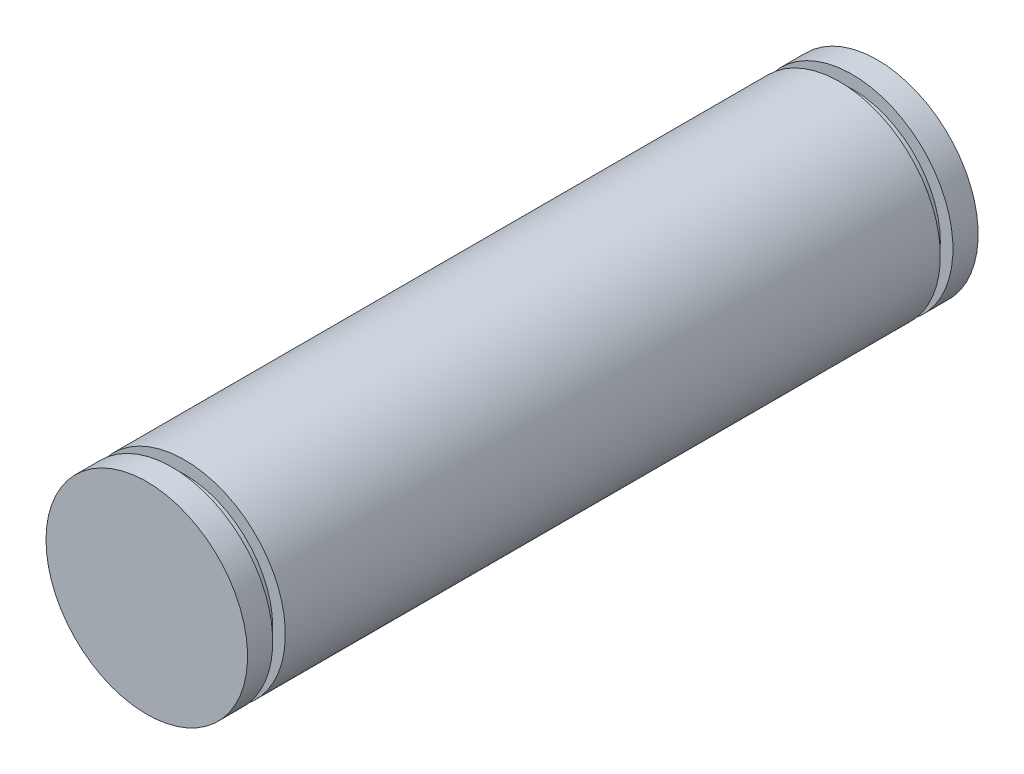
ISO-10303-21;
HEADER;
FILE_DESCRIPTION(('STEP AP214'),'2;1');
FILE_NAME('part.step','',(''),(''),'','','');
FILE_SCHEMA(('AUTOMOTIVE_DESIGN { 1 0 10303 214 1 1 1 1 }'));
ENDSEC;
DATA;
#1=APPLICATION_CONTEXT('core data for automotive mechanical design processes');
#2=APPLICATION_PROTOCOL_DEFINITION('international standard','automotive_design',2000,#1);
#3=PRODUCT_CONTEXT('',#1,'mechanical');
#4=PRODUCT('Part','Part','',(#3));
#5=PRODUCT_RELATED_PRODUCT_CATEGORY('part','',(#4));
#6=PRODUCT_DEFINITION_FORMATION('','',#4);
#7=PRODUCT_DEFINITION_CONTEXT('part definition',#1,'design');
#8=PRODUCT_DEFINITION('design','',#6,#7);
#9=PRODUCT_DEFINITION_SHAPE('','',#8);
#10=(LENGTH_UNIT() NAMED_UNIT(*) SI_UNIT(.MILLI.,.METRE.));
#11=(NAMED_UNIT(*) PLANE_ANGLE_UNIT() SI_UNIT($,.RADIAN.));
#12=(NAMED_UNIT(*) SI_UNIT($,.STERADIAN.) SOLID_ANGLE_UNIT());
#13=UNCERTAINTY_MEASURE_WITH_UNIT(LENGTH_MEASURE(1.E-05),#10,'distance_accuracy_value','');
#14=(GEOMETRIC_REPRESENTATION_CONTEXT(3) GLOBAL_UNCERTAINTY_ASSIGNED_CONTEXT((#13)) GLOBAL_UNIT_ASSIGNED_CONTEXT((#10,
#11,#12)) REPRESENTATION_CONTEXT('',''));
#15=CARTESIAN_POINT('',(0.,0.,0.));
#16=DIRECTION('',(0.,0.,1.));
#17=DIRECTION('',(1.,0.,0.));
#18=AXIS2_PLACEMENT_3D('',#15,#16,#17);
#19=CARTESIAN_POINT('',(0.,0.,58.));
#20=DIRECTION('',(0.,0.,-1.));
#21=DIRECTION('',(-1.,0.,0.));
#22=AXIS2_PLACEMENT_3D('',#19,#20,#21);
#23=CYLINDRICAL_SURFACE('',#22,8.);
#24=CARTESIAN_POINT('',(0.,0.,55.));
#25=DIRECTION('',(0.,0.,1.));
#26=DIRECTION('',(1.,0.,0.));
#27=AXIS2_PLACEMENT_3D('',#24,#25,#26);
#28=CIRCLE('',#27,8.);
#29=CARTESIAN_POINT('',(-8.,0.,55.));
#30=VERTEX_POINT('',#29);
#31=EDGE_CURVE('E54',#30,#30,#28,.T.);
#32=CARTESIAN_POINT('',(0.,0.,3.));
#33=DIRECTION('',(0.,0.,-1.));
#34=DIRECTION('',(-1.,0.,0.));
#35=AXIS2_PLACEMENT_3D('',#32,#33,#34);
#36=CIRCLE('',#35,8.);
#37=CARTESIAN_POINT('',(-8.,0.,3.));
#38=VERTEX_POINT('',#37);
#39=EDGE_CURVE('E43',#38,#38,#36,.T.);
#40=CARTESIAN_POINT('',(-8.,0.,55.));
#41=CARTESIAN_POINT('',(-8.,0.,54.4583333333333));
#42=CARTESIAN_POINT('',(-8.,0.,53.9166666666667));
#43=CARTESIAN_POINT('',(-8.,0.,52.8333333333333));
#44=CARTESIAN_POINT('',(-8.,0.,52.2916666666667));
#45=CARTESIAN_POINT('',(-8.,0.,51.2083333333333));
#46=CARTESIAN_POINT('',(-8.,0.,50.6666666666667));
#47=CARTESIAN_POINT('',(-8.,0.,49.5833333333333));
#48=CARTESIAN_POINT('',(-8.,0.,49.0416666666667));
#49=CARTESIAN_POINT('',(-8.,0.,47.9583333333333));
#50=CARTESIAN_POINT('',(-8.,0.,47.4166666666667));
#51=CARTESIAN_POINT('',(-8.,0.,46.3333333333333));
#52=CARTESIAN_POINT('',(-8.,0.,45.7916666666667));
#53=CARTESIAN_POINT('',(-8.,0.,44.7083333333333));
#54=CARTESIAN_POINT('',(-8.,0.,44.1666666666667));
#55=CARTESIAN_POINT('',(-8.,0.,43.0833333333333));
#56=CARTESIAN_POINT('',(-8.,0.,42.5416666666667));
#57=CARTESIAN_POINT('',(-8.,0.,41.4583333333333));
#58=CARTESIAN_POINT('',(-8.,0.,40.9166666666667));
#59=CARTESIAN_POINT('',(-8.,0.,39.8333333333333));
#60=CARTESIAN_POINT('',(-8.,0.,39.2916666666667));
#61=CARTESIAN_POINT('',(-8.,0.,38.2083333333333));
#62=CARTESIAN_POINT('',(-8.,0.,37.6666666666667));
#63=CARTESIAN_POINT('',(-8.,0.,36.5833333333333));
#64=CARTESIAN_POINT('',(-8.,0.,36.0416666666667));
#65=CARTESIAN_POINT('',(-8.,0.,34.9583333333333));
#66=CARTESIAN_POINT('',(-8.,0.,34.4166666666667));
#67=CARTESIAN_POINT('',(-8.,0.,33.3333333333333));
#68=CARTESIAN_POINT('',(-8.,0.,32.7916666666667));
#69=CARTESIAN_POINT('',(-8.,0.,31.7083333333333));
#70=CARTESIAN_POINT('',(-8.,0.,31.1666666666667));
#71=CARTESIAN_POINT('',(-8.,0.,30.0833333333333));
#72=CARTESIAN_POINT('',(-8.,0.,29.5416666666667));
#73=CARTESIAN_POINT('',(-8.,0.,28.4583333333333));
#74=CARTESIAN_POINT('',(-8.,0.,27.9166666666667));
#75=CARTESIAN_POINT('',(-8.,0.,26.8333333333333));
#76=CARTESIAN_POINT('',(-8.,0.,26.2916666666667));
#77=CARTESIAN_POINT('',(-8.,0.,25.2083333333333));
#78=CARTESIAN_POINT('',(-8.,0.,24.6666666666667));
#79=CARTESIAN_POINT('',(-8.,0.,23.5833333333333));
#80=CARTESIAN_POINT('',(-8.,0.,23.0416666666667));
#81=CARTESIAN_POINT('',(-8.,0.,21.9583333333333));
#82=CARTESIAN_POINT('',(-8.,0.,21.4166666666667));
#83=CARTESIAN_POINT('',(-8.,0.,20.3333333333333));
#84=CARTESIAN_POINT('',(-8.,0.,19.7916666666667));
#85=CARTESIAN_POINT('',(-8.,0.,18.7083333333333));
#86=CARTESIAN_POINT('',(-8.,0.,18.1666666666667));
#87=CARTESIAN_POINT('',(-8.,0.,17.0833333333333));
#88=CARTESIAN_POINT('',(-8.,0.,16.5416666666667));
#89=CARTESIAN_POINT('',(-8.,0.,15.4583333333333));
#90=CARTESIAN_POINT('',(-8.,0.,14.9166666666667));
#91=CARTESIAN_POINT('',(-8.,0.,13.8333333333333));
#92=CARTESIAN_POINT('',(-8.,0.,13.2916666666667));
#93=CARTESIAN_POINT('',(-8.,0.,12.2083333333333));
#94=CARTESIAN_POINT('',(-8.,0.,11.6666666666667));
#95=CARTESIAN_POINT('',(-8.,0.,10.5833333333333));
#96=CARTESIAN_POINT('',(-8.,0.,10.0416666666667));
#97=CARTESIAN_POINT('',(-8.,0.,8.95833333333333));
#98=CARTESIAN_POINT('',(-8.,0.,8.41666666666666));
#99=CARTESIAN_POINT('',(-8.,0.,7.33333333333333));
#100=CARTESIAN_POINT('',(-8.,0.,6.79166666666667));
#101=CARTESIAN_POINT('',(-8.,0.,5.70833333333334));
#102=CARTESIAN_POINT('',(-8.,0.,5.16666666666667));
#103=CARTESIAN_POINT('',(-8.,0.,4.08333333333334));
#104=CARTESIAN_POINT('',(-8.,0.,3.54166666666667));
#105=CARTESIAN_POINT('',(-8.,0.,3.));
#106=B_SPLINE_CURVE_WITH_KNOTS('',3,(#40,#41,#42,#43,#44,#45,#46,#47,#48,#49,#50,#51,#52,#53,
#54,#55,#56,#57,#58,#59,#60,#61,#62,#63,#64,#65,#66,#67,#68,#69,#70,#71,#72,#73,#74,#75,#76,#77,
#78,#79,#80,#81,#82,#83,#84,#85,#86,#87,#88,#89,#90,#91,#92,#93,#94,#95,#96,#97,#98,#99,#100,
#101,#102,#103,#104,#105),.UNSPECIFIED.,.F.,.F.,(4,2,2,2,2,2,2,2,2,2,2,2,2,2,2,2,2,2,2,2,2,2,2,
2,2,2,2,2,2,2,2,2,4),(0.,1.625,3.25,4.875,6.5,8.125,9.75,11.375,13.,14.625,16.25,17.875,19.5,
21.125,22.75,24.375,26.,27.625,29.25,30.875,32.5,34.125,35.75,37.375,39.,40.625,42.25,43.875,
45.5,47.125,48.75,50.375,52.),.UNSPECIFIED.);
#107=EDGE_CURVE('BSEAM39',#30,#38,#106,.T.);
#108=ORIENTED_EDGE('',*,*,#31,.F.);
#109=ORIENTED_EDGE('',*,*,#39,.F.);
#110=ORIENTED_EDGE('',*,*,#107,.T.);
#111=ORIENTED_EDGE('',*,*,#107,.F.);
#112=EDGE_LOOP('',(#108,#110,#109,#111));
#113=FACE_BOUND('',#112,.T.);
#114=ADVANCED_FACE('F39',(#113),#23,.T.);
#115=CARTESIAN_POINT('',(0.,0.,55.));
#116=DIRECTION('',(0.,0.,1.));
#117=DIRECTION('',(1.,0.,0.));
#118=AXIS2_PLACEMENT_3D('',#115,#116,#117);
#119=PLANE('',#118);
#120=CARTESIAN_POINT('',(0.,0.,55.));
#121=DIRECTION('',(0.,0.,1.));
#122=DIRECTION('',(1.,0.,0.));
#123=AXIS2_PLACEMENT_3D('',#120,#121,#122);
#124=CIRCLE('',#123,7.);
#125=CARTESIAN_POINT('',(7.,0.,55.));
#126=VERTEX_POINT('',#125);
#127=EDGE_CURVE('E64',#126,#126,#124,.T.);
#128=ORIENTED_EDGE('',*,*,#127,.F.);
#129=EDGE_LOOP('',(#128));
#130=FACE_BOUND('',#129,.T.);
#131=ORIENTED_EDGE('',*,*,#31,.T.);
#132=EDGE_LOOP('',(#131));
#133=FACE_BOUND('',#132,.T.);
#134=ADVANCED_FACE('F104',(#130,#133),#119,.T.);
#135=CARTESIAN_POINT('',(0.,0.,56.));
#136=DIRECTION('',(0.,0.,1.));
#137=DIRECTION('',(1.,0.,0.));
#138=AXIS2_PLACEMENT_3D('',#135,#136,#137);
#139=PLANE('',#138);
#140=CARTESIAN_POINT('',(0.,0.,56.));
#141=DIRECTION('',(0.,0.,1.));
#142=DIRECTION('',(1.,0.,0.));
#143=AXIS2_PLACEMENT_3D('',#140,#141,#142);
#144=CIRCLE('',#143,7.);
#145=CARTESIAN_POINT('',(7.,0.,56.));
#146=VERTEX_POINT('',#145);
#147=EDGE_CURVE('E57',#146,#146,#144,.T.);
#148=ORIENTED_EDGE('',*,*,#147,.T.);
#149=EDGE_LOOP('',(#148));
#150=FACE_BOUND('',#149,.T.);
#151=CARTESIAN_POINT('',(0.,0.,56.));
#152=DIRECTION('',(0.,0.,1.));
#153=DIRECTION('',(1.,0.,0.));
#154=AXIS2_PLACEMENT_3D('',#151,#152,#153);
#155=CIRCLE('',#154,8.);
#156=CARTESIAN_POINT('',(-8.,0.,56.));
#157=VERTEX_POINT('',#156);
#158=EDGE_CURVE('E60',#157,#157,#155,.T.);
#159=ORIENTED_EDGE('',*,*,#158,.F.);
#160=EDGE_LOOP('',(#159));
#161=FACE_BOUND('',#160,.T.);
#162=ADVANCED_FACE('F92',(#150,#161),#139,.F.);
#163=CARTESIAN_POINT('',(0.,0.,55.));
#164=DIRECTION('',(0.,0.,1.));
#165=DIRECTION('',(1.,0.,0.));
#166=AXIS2_PLACEMENT_3D('',#163,#164,#165);
#167=CYLINDRICAL_SURFACE('',#166,7.);
#168=ORIENTED_EDGE('',*,*,#127,.T.);
#169=EDGE_LOOP('',(#168));
#170=FACE_BOUND('',#169,.T.);
#171=ORIENTED_EDGE('',*,*,#147,.F.);
#172=EDGE_LOOP('',(#171));
#173=FACE_BOUND('',#172,.T.);
#174=ADVANCED_FACE('F95',(#170,#173),#167,.T.);
#175=CARTESIAN_POINT('',(0.,0.,58.));
#176=DIRECTION('',(0.,0.,1.));
#177=DIRECTION('',(1.,0.,0.));
#178=AXIS2_PLACEMENT_3D('',#175,#176,#177);
#179=PLANE('',#178);
#180=CARTESIAN_POINT('',(0.,0.,58.));
#181=DIRECTION('',(0.,0.,1.));
#182=DIRECTION('',(1.,0.,0.));
#183=AXIS2_PLACEMENT_3D('',#180,#181,#182);
#184=CIRCLE('',#183,8.);
#185=CARTESIAN_POINT('',(-8.,0.,58.));
#186=VERTEX_POINT('',#185);
#187=EDGE_CURVE('E11',#186,#186,#184,.T.);
#188=ORIENTED_EDGE('',*,*,#187,.T.);
#189=EDGE_LOOP('',(#188));
#190=FACE_BOUND('',#189,.T.);
#191=ADVANCED_FACE('F97',(#190),#179,.T.);
#192=CARTESIAN_POINT('',(-8.,0.,56.));
#193=CARTESIAN_POINT('',(-8.,0.,56.0208333333333));
#194=CARTESIAN_POINT('',(-8.,0.,56.0416666666667));
#195=CARTESIAN_POINT('',(-8.,0.,56.0833333333333));
#196=CARTESIAN_POINT('',(-8.,0.,56.1041666666667));
#197=CARTESIAN_POINT('',(-8.,0.,56.1458333333333));
#198=CARTESIAN_POINT('',(-8.,0.,56.1666666666667));
#199=CARTESIAN_POINT('',(-8.,0.,56.2083333333333));
#200=CARTESIAN_POINT('',(-8.,0.,56.2291666666667));
#201=CARTESIAN_POINT('',(-8.,0.,56.2708333333333));
#202=CARTESIAN_POINT('',(-8.,0.,56.2916666666667));
#203=CARTESIAN_POINT('',(-8.,0.,56.3333333333333));
#204=CARTESIAN_POINT('',(-8.,0.,56.3541666666667));
#205=CARTESIAN_POINT('',(-8.,0.,56.3958333333333));
#206=CARTESIAN_POINT('',(-8.,0.,56.4166666666667));
#207=CARTESIAN_POINT('',(-8.,0.,56.4583333333333));
#208=CARTESIAN_POINT('',(-8.,0.,56.4791666666667));
#209=CARTESIAN_POINT('',(-8.,0.,56.5208333333333));
#210=CARTESIAN_POINT('',(-8.,0.,56.5416666666667));
#211=CARTESIAN_POINT('',(-8.,0.,56.5833333333333));
#212=CARTESIAN_POINT('',(-8.,0.,56.6041666666667));
#213=CARTESIAN_POINT('',(-8.,0.,56.6458333333333));
#214=CARTESIAN_POINT('',(-8.,0.,56.6666666666667));
#215=CARTESIAN_POINT('',(-8.,0.,56.7083333333333));
#216=CARTESIAN_POINT('',(-8.,0.,56.7291666666667));
#217=CARTESIAN_POINT('',(-8.,0.,56.7708333333333));
#218=CARTESIAN_POINT('',(-8.,0.,56.7916666666667));
#219=CARTESIAN_POINT('',(-8.,0.,56.8333333333333));
#220=CARTESIAN_POINT('',(-8.,0.,56.8541666666667));
#221=CARTESIAN_POINT('',(-8.,0.,56.8958333333333));
#222=CARTESIAN_POINT('',(-8.,0.,56.9166666666667));
#223=CARTESIAN_POINT('',(-8.,0.,56.9583333333333));
#224=CARTESIAN_POINT('',(-8.,0.,56.9791666666667));
#225=CARTESIAN_POINT('',(-8.,0.,57.0208333333333));
#226=CARTESIAN_POINT('',(-8.,0.,57.0416666666667));
#227=CARTESIAN_POINT('',(-8.,0.,57.0833333333333));
#228=CARTESIAN_POINT('',(-8.,0.,57.1041666666667));
#229=CARTESIAN_POINT('',(-8.,0.,57.1458333333333));
#230=CARTESIAN_POINT('',(-8.,0.,57.1666666666667));
#231=CARTESIAN_POINT('',(-8.,0.,57.2083333333333));
#232=CARTESIAN_POINT('',(-8.,0.,57.2291666666667));
#233=CARTESIAN_POINT('',(-8.,0.,57.2708333333333));
#234=CARTESIAN_POINT('',(-8.,0.,57.2916666666667));
#235=CARTESIAN_POINT('',(-8.,0.,57.3333333333333));
#236=CARTESIAN_POINT('',(-8.,0.,57.3541666666667));
#237=CARTESIAN_POINT('',(-8.,0.,57.3958333333333));
#238=CARTESIAN_POINT('',(-8.,0.,57.4166666666667));
#239=CARTESIAN_POINT('',(-8.,0.,57.4583333333333));
#240=CARTESIAN_POINT('',(-8.,0.,57.4791666666667));
#241=CARTESIAN_POINT('',(-8.,0.,57.5208333333333));
#242=CARTESIAN_POINT('',(-8.,0.,57.5416666666667));
#243=CARTESIAN_POINT('',(-8.,0.,57.5833333333333));
#244=CARTESIAN_POINT('',(-8.,0.,57.6041666666667));
#245=CARTESIAN_POINT('',(-8.,0.,57.6458333333333));
#246=CARTESIAN_POINT('',(-8.,0.,57.6666666666667));
#247=CARTESIAN_POINT('',(-8.,0.,57.7083333333333));
#248=CARTESIAN_POINT('',(-8.,0.,57.7291666666667));
#249=CARTESIAN_POINT('',(-8.,0.,57.7708333333333));
#250=CARTESIAN_POINT('',(-8.,0.,57.7916666666667));
#251=CARTESIAN_POINT('',(-8.,0.,57.8333333333333));
#252=CARTESIAN_POINT('',(-8.,0.,57.8541666666667));
#253=CARTESIAN_POINT('',(-8.,0.,57.8958333333333));
#254=CARTESIAN_POINT('',(-8.,0.,57.9166666666667));
#255=CARTESIAN_POINT('',(-8.,0.,57.9583333333333));
#256=CARTESIAN_POINT('',(-8.,0.,57.9791666666667));
#257=CARTESIAN_POINT('',(-8.,0.,58.));
#258=B_SPLINE_CURVE_WITH_KNOTS('',3,(#192,#193,#194,#195,#196,#197,#198,#199,#200,#201,#202,
#203,#204,#205,#206,#207,#208,#209,#210,#211,#212,#213,#214,#215,#216,#217,#218,#219,#220,#221,
#222,#223,#224,#225,#226,#227,#228,#229,#230,#231,#232,#233,#234,#235,#236,#237,#238,#239,#240,
#241,#242,#243,#244,#245,#246,#247,#248,#249,#250,#251,#252,#253,#254,#255,#256,#257),
.UNSPECIFIED.,.F.,.F.,(4,2,2,2,2,2,2,2,2,2,2,2,2,2,2,2,2,2,2,2,2,2,2,2,2,2,2,2,2,2,2,2,4),(0.,
0.0625000000000001,0.125,0.1875,0.25,0.3125,0.375,0.4375,0.5,0.5625,0.625000000000001,
0.687500000000001,0.750000000000001,0.812500000000001,0.875000000000001,0.937500000000001,1.,
1.0625,1.125,1.1875,1.25,1.3125,1.375,1.4375,1.5,1.5625,1.625,1.6875,1.75,1.8125,1.875,1.9375,
2.),.UNSPECIFIED.);
#259=EDGE_CURVE('BSEAM41',#157,#186,#258,.T.);
#260=ORIENTED_EDGE('',*,*,#158,.T.);
#261=ORIENTED_EDGE('',*,*,#187,.F.);
#262=ORIENTED_EDGE('',*,*,#259,.T.);
#263=ORIENTED_EDGE('',*,*,#259,.F.);
#264=EDGE_LOOP('',(#260,#262,#261,#263));
#265=FACE_BOUND('',#264,.T.);
#266=ADVANCED_FACE('F41',(#265),#23,.T.);
#267=CARTESIAN_POINT('',(0.,0.,3.));
#268=DIRECTION('',(0.,0.,-1.));
#269=DIRECTION('',(-1.,0.,0.));
#270=AXIS2_PLACEMENT_3D('',#267,#268,#269);
#271=PLANE('',#270);
#272=CARTESIAN_POINT('',(0.,0.,3.));
#273=DIRECTION('',(0.,0.,1.));
#274=DIRECTION('',(1.,0.,0.));
#275=AXIS2_PLACEMENT_3D('',#272,#273,#274);
#276=CIRCLE('',#275,7.);
#277=CARTESIAN_POINT('',(7.,0.,3.));
#278=VERTEX_POINT('',#277);
#279=EDGE_CURVE('E70',#278,#278,#276,.T.);
#280=ORIENTED_EDGE('',*,*,#279,.T.);
#281=EDGE_LOOP('',(#280));
#282=FACE_BOUND('',#281,.T.);
#283=ORIENTED_EDGE('',*,*,#39,.T.);
#284=EDGE_LOOP('',(#283));
#285=FACE_BOUND('',#284,.T.);
#286=ADVANCED_FACE('F120',(#282,#285),#271,.T.);
#287=CARTESIAN_POINT('',(0.,0.,2.));
#288=DIRECTION('',(0.,0.,-1.));
#289=DIRECTION('',(-1.,0.,0.));
#290=AXIS2_PLACEMENT_3D('',#287,#288,#289);
#291=PLANE('',#290);
#292=CARTESIAN_POINT('',(0.,0.,2.));
#293=DIRECTION('',(0.,0.,1.));
#294=DIRECTION('',(1.,0.,0.));
#295=AXIS2_PLACEMENT_3D('',#292,#293,#294);
#296=CIRCLE('',#295,7.);
#297=CARTESIAN_POINT('',(7.,0.,2.));
#298=VERTEX_POINT('',#297);
#299=EDGE_CURVE('E77',#298,#298,#296,.T.);
#300=ORIENTED_EDGE('',*,*,#299,.F.);
#301=EDGE_LOOP('',(#300));
#302=FACE_BOUND('',#301,.T.);
#303=CARTESIAN_POINT('',(0.,0.,2.));
#304=DIRECTION('',(0.,0.,-1.));
#305=DIRECTION('',(-1.,0.,0.));
#306=AXIS2_PLACEMENT_3D('',#303,#304,#305);
#307=CIRCLE('',#306,8.);
#308=CARTESIAN_POINT('',(-8.,0.,2.));
#309=VERTEX_POINT('',#308);
#310=EDGE_CURVE('E67',#309,#309,#307,.T.);
#311=ORIENTED_EDGE('',*,*,#310,.F.);
#312=EDGE_LOOP('',(#311));
#313=FACE_BOUND('',#312,.T.);
#314=ADVANCED_FACE('F125',(#302,#313),#291,.F.);
#315=CARTESIAN_POINT('',(0.,0.,3.));
#316=DIRECTION('',(0.,0.,-1.));
#317=DIRECTION('',(-1.,0.,0.));
#318=AXIS2_PLACEMENT_3D('',#315,#316,#317);
#319=CYLINDRICAL_SURFACE('',#318,7.);
#320=ORIENTED_EDGE('',*,*,#279,.F.);
#321=EDGE_LOOP('',(#320));
#322=FACE_BOUND('',#321,.T.);
#323=ORIENTED_EDGE('',*,*,#299,.T.);
#324=EDGE_LOOP('',(#323));
#325=FACE_BOUND('',#324,.T.);
#326=ADVANCED_FACE('F132',(#322,#325),#319,.T.);
#327=CARTESIAN_POINT('',(0.,0.,0.));
#328=DIRECTION('',(0.,0.,1.));
#329=DIRECTION('',(1.,0.,0.));
#330=AXIS2_PLACEMENT_3D('',#327,#328,#329);
#331=PLANE('',#330);
#332=CARTESIAN_POINT('',(0.,0.,0.));
#333=DIRECTION('',(0.,0.,1.));
#334=DIRECTION('',(1.,0.,0.));
#335=AXIS2_PLACEMENT_3D('',#332,#333,#334);
#336=CIRCLE('',#335,8.);
#337=CARTESIAN_POINT('',(-8.,0.,0.));
#338=VERTEX_POINT('',#337);
#339=EDGE_CURVE('E48',#338,#338,#336,.T.);
#340=ORIENTED_EDGE('',*,*,#339,.F.);
#341=EDGE_LOOP('',(#340));
#342=FACE_BOUND('',#341,.T.);
#343=ADVANCED_FACE('F118',(#342),#331,.F.);
#344=CARTESIAN_POINT('',(-8.,0.,2.));
#345=CARTESIAN_POINT('',(-8.,0.,1.97916666666667));
#346=CARTESIAN_POINT('',(-8.,0.,1.95833333333334));
#347=CARTESIAN_POINT('',(-8.,0.,1.91666666666667));
#348=CARTESIAN_POINT('',(-8.,0.,1.89583333333334));
#349=CARTESIAN_POINT('',(-8.,0.,1.85416666666667));
#350=CARTESIAN_POINT('',(-8.,0.,1.83333333333334));
#351=CARTESIAN_POINT('',(-8.,0.,1.79166666666667));
#352=CARTESIAN_POINT('',(-8.,0.,1.77083333333334));
#353=CARTESIAN_POINT('',(-8.,0.,1.72916666666667));
#354=CARTESIAN_POINT('',(-8.,0.,1.70833333333333));
#355=CARTESIAN_POINT('',(-8.,0.,1.66666666666667));
#356=CARTESIAN_POINT('',(-8.,0.,1.64583333333333));
#357=CARTESIAN_POINT('',(-8.,0.,1.60416666666667));
#358=CARTESIAN_POINT('',(-8.,0.,1.58333333333333));
#359=CARTESIAN_POINT('',(-8.,0.,1.54166666666667));
#360=CARTESIAN_POINT('',(-8.,0.,1.52083333333333));
#361=CARTESIAN_POINT('',(-8.,0.,1.47916666666667));
#362=CARTESIAN_POINT('',(-8.,0.,1.45833333333333));
#363=CARTESIAN_POINT('',(-8.,0.,1.41666666666667));
#364=CARTESIAN_POINT('',(-8.,0.,1.39583333333333));
#365=CARTESIAN_POINT('',(-8.,0.,1.35416666666667));
#366=CARTESIAN_POINT('',(-8.,0.,1.33333333333333));
#367=CARTESIAN_POINT('',(-8.,0.,1.29166666666667));
#368=CARTESIAN_POINT('',(-8.,0.,1.27083333333333));
#369=CARTESIAN_POINT('',(-8.,0.,1.22916666666667));
#370=CARTESIAN_POINT('',(-8.,0.,1.20833333333333));
#371=CARTESIAN_POINT('',(-8.,0.,1.16666666666667));
#372=CARTESIAN_POINT('',(-8.,0.,1.14583333333333));
#373=CARTESIAN_POINT('',(-8.,0.,1.10416666666667));
#374=CARTESIAN_POINT('',(-8.,0.,1.08333333333333));
#375=CARTESIAN_POINT('',(-8.,0.,1.04166666666667));
#376=CARTESIAN_POINT('',(-8.,0.,1.02083333333333));
#377=CARTESIAN_POINT('',(-8.,0.,0.979166666666668));
#378=CARTESIAN_POINT('',(-8.,0.,0.958333333333334));
#379=CARTESIAN_POINT('',(-8.,0.,0.916666666666668));
#380=CARTESIAN_POINT('',(-8.,0.,0.895833333333334));
#381=CARTESIAN_POINT('',(-8.,0.,0.854166666666667));
#382=CARTESIAN_POINT('',(-8.,0.,0.833333333333334));
#383=CARTESIAN_POINT('',(-8.,0.,0.791666666666667));
#384=CARTESIAN_POINT('',(-8.,0.,0.770833333333334));
#385=CARTESIAN_POINT('',(-8.,0.,0.729166666666667));
#386=CARTESIAN_POINT('',(-8.,0.,0.708333333333334));
#387=CARTESIAN_POINT('',(-8.,0.,0.666666666666667));
#388=CARTESIAN_POINT('',(-8.,0.,0.645833333333334));
#389=CARTESIAN_POINT('',(-8.,0.,0.604166666666667));
#390=CARTESIAN_POINT('',(-8.,0.,0.583333333333334));
#391=CARTESIAN_POINT('',(-8.,0.,0.541666666666667));
#392=CARTESIAN_POINT('',(-8.,0.,0.520833333333334));
#393=CARTESIAN_POINT('',(-8.,0.,0.479166666666667));
#394=CARTESIAN_POINT('',(-8.,0.,0.458333333333334));
#395=CARTESIAN_POINT('',(-8.,0.,0.416666666666667));
#396=CARTESIAN_POINT('',(-8.,0.,0.395833333333334));
#397=CARTESIAN_POINT('',(-8.,0.,0.354166666666667));
#398=CARTESIAN_POINT('',(-8.,0.,0.333333333333334));
#399=CARTESIAN_POINT('',(-8.,0.,0.291666666666667));
#400=CARTESIAN_POINT('',(-8.,0.,0.270833333333334));
#401=CARTESIAN_POINT('',(-8.,0.,0.229166666666667));
#402=CARTESIAN_POINT('',(-8.,0.,0.208333333333334));
#403=CARTESIAN_POINT('',(-8.,0.,0.166666666666667));
#404=CARTESIAN_POINT('',(-8.,0.,0.145833333333333));
#405=CARTESIAN_POINT('',(-8.,0.,0.104166666666667));
#406=CARTESIAN_POINT('',(-8.,0.,0.0833333333333334));
#407=CARTESIAN_POINT('',(-8.,0.,0.0416666666666667));
#408=CARTESIAN_POINT('',(-8.,0.,0.0208333333333333));
#409=CARTESIAN_POINT('',(-8.,0.,0.));
#410=B_SPLINE_CURVE_WITH_KNOTS('',3,(#344,#345,#346,#347,#348,#349,#350,#351,#352,#353,#354,
#355,#356,#357,#358,#359,#360,#361,#362,#363,#364,#365,#366,#367,#368,#369,#370,#371,#372,#373,
#374,#375,#376,#377,#378,#379,#380,#381,#382,#383,#384,#385,#386,#387,#388,#389,#390,#391,#392,
#393,#394,#395,#396,#397,#398,#399,#400,#401,#402,#403,#404,#405,#406,#407,#408,#409),
.UNSPECIFIED.,.F.,.F.,(4,2,2,2,2,2,2,2,2,2,2,2,2,2,2,2,2,2,2,2,2,2,2,2,2,2,2,2,2,2,2,2,4),(0.,
0.0625000000000001,0.125,0.1875,0.25,0.3125,0.375,0.4375,0.5,0.5625,0.625000000000001,
0.687500000000001,0.750000000000001,0.812500000000001,0.875000000000001,0.937500000000001,1.,
1.0625,1.125,1.1875,1.25,1.3125,1.375,1.4375,1.5,1.5625,1.625,1.6875,1.75,1.8125,1.875,1.9375,
2.),.UNSPECIFIED.);
#411=EDGE_CURVE('BSEAM110',#309,#338,#410,.T.);
#412=ORIENTED_EDGE('',*,*,#310,.T.);
#413=ORIENTED_EDGE('',*,*,#339,.T.);
#414=ORIENTED_EDGE('',*,*,#411,.T.);
#415=ORIENTED_EDGE('',*,*,#411,.F.);
#416=EDGE_LOOP('',(#412,#414,#413,#415));
#417=FACE_BOUND('',#416,.T.);
#418=ADVANCED_FACE('F110',(#417),#23,.T.);
#419=CLOSED_SHELL('',(#114,#134,#162,#174,#191,#266,#286,#314,#326,#343,#418));
#420=MANIFOLD_SOLID_BREP('B2',#419);
#421=ADVANCED_BREP_SHAPE_REPRESENTATION('',(#18,#420),#14);
#422=SHAPE_DEFINITION_REPRESENTATION(#9,#421);
ENDSEC;
END-ISO-10303-21;
